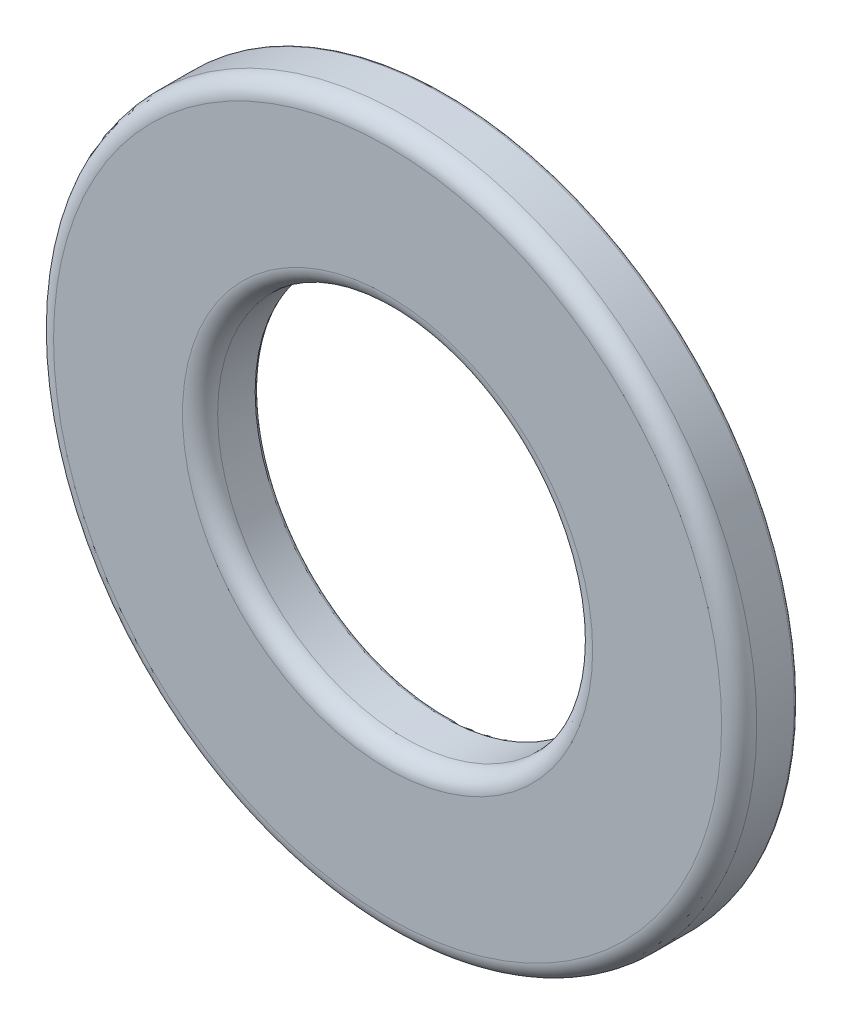
ISO-10303-21;
HEADER;
FILE_DESCRIPTION(('STEP AP214'),'2;1');
FILE_NAME('part.step','',(''),(''),'','','');
FILE_SCHEMA(('AUTOMOTIVE_DESIGN { 1 0 10303 214 1 1 1 1 }'));
ENDSEC;
DATA;
#1=APPLICATION_CONTEXT('core data for automotive mechanical design processes');
#2=APPLICATION_PROTOCOL_DEFINITION('international standard','automotive_design',2000,#1);
#3=PRODUCT_CONTEXT('',#1,'mechanical');
#4=PRODUCT('Part','Part','',(#3));
#5=PRODUCT_RELATED_PRODUCT_CATEGORY('part','',(#4));
#6=PRODUCT_DEFINITION_FORMATION('','',#4);
#7=PRODUCT_DEFINITION_CONTEXT('part definition',#1,'design');
#8=PRODUCT_DEFINITION('design','',#6,#7);
#9=PRODUCT_DEFINITION_SHAPE('','',#8);
#10=(LENGTH_UNIT() NAMED_UNIT(*) SI_UNIT(.MILLI.,.METRE.));
#11=(NAMED_UNIT(*) PLANE_ANGLE_UNIT() SI_UNIT($,.RADIAN.));
#12=(NAMED_UNIT(*) SI_UNIT($,.STERADIAN.) SOLID_ANGLE_UNIT());
#13=UNCERTAINTY_MEASURE_WITH_UNIT(LENGTH_MEASURE(1.E-05),#10,'distance_accuracy_value','');
#14=(GEOMETRIC_REPRESENTATION_CONTEXT(3) GLOBAL_UNCERTAINTY_ASSIGNED_CONTEXT((#13)) GLOBAL_UNIT_ASSIGNED_CONTEXT((#10,
#11,#12)) REPRESENTATION_CONTEXT('',''));
#15=CARTESIAN_POINT('',(0.,0.,0.));
#16=DIRECTION('',(0.,0.,1.));
#17=DIRECTION('',(1.,0.,0.));
#18=AXIS2_PLACEMENT_3D('',#15,#16,#17);
#19=CARTESIAN_POINT('',(0.,0.,-0.25));
#20=DIRECTION('',(0.,0.,1.));
#21=DIRECTION('',(1.,0.,0.));
#22=AXIS2_PLACEMENT_3D('',#19,#20,#21);
#23=CYLINDRICAL_SURFACE('',#22,3.);
#24=CARTESIAN_POINT('',(0.,0.,-0.22));
#25=DIRECTION('',(0.,0.,1.));
#26=DIRECTION('',(1.,0.,0.));
#27=AXIS2_PLACEMENT_3D('',#24,#25,#26);
#28=CIRCLE('',#27,3.);
#29=CARTESIAN_POINT('',(3.,0.,-0.22));
#30=VERTEX_POINT('',#29);
#31=EDGE_CURVE('E96',#30,#30,#28,.T.);
#32=ORIENTED_EDGE('',*,*,#31,.T.);
#33=EDGE_LOOP('',(#32));
#34=FACE_BOUND('',#33,.T.);
#35=CARTESIAN_POINT('',(0.,0.,0.1));
#36=DIRECTION('',(0.,0.,1.));
#37=DIRECTION('',(1.,0.,0.));
#38=AXIS2_PLACEMENT_3D('',#35,#36,#37);
#39=CIRCLE('',#38,3.);
#40=CARTESIAN_POINT('',(3.,0.,0.1));
#41=VERTEX_POINT('',#40);
#42=EDGE_CURVE('E101',#41,#41,#39,.F.);
#43=ORIENTED_EDGE('',*,*,#42,.T.);
#44=EDGE_LOOP('',(#43));
#45=FACE_BOUND('',#44,.T.);
#46=ADVANCED_FACE('F81',(#34,#45),#23,.T.);
#47=CARTESIAN_POINT('',(0.,0.,-0.25));
#48=DIRECTION('',(0.,0.,1.));
#49=DIRECTION('',(1.,0.,0.));
#50=AXIS2_PLACEMENT_3D('',#47,#48,#49);
#51=PLANE('',#50);
#52=CARTESIAN_POINT('',(0.,0.,-0.25));
#53=DIRECTION('',(0.,0.,1.));
#54=DIRECTION('',(1.,0.,0.));
#55=AXIS2_PLACEMENT_3D('',#52,#53,#54);
#56=CIRCLE('',#55,2.97);
#57=CARTESIAN_POINT('',(2.97,0.,-0.25));
#58=VERTEX_POINT('',#57);
#59=EDGE_CURVE('E88',#58,#58,#56,.F.);
#60=ORIENTED_EDGE('',*,*,#59,.T.);
#61=EDGE_LOOP('',(#60));
#62=FACE_BOUND('',#61,.T.);
#63=CARTESIAN_POINT('',(0.,0.,-0.25));
#64=DIRECTION('',(0.,0.,1.));
#65=DIRECTION('',(1.,0.,0.));
#66=AXIS2_PLACEMENT_3D('',#63,#64,#65);
#67=CIRCLE('',#66,1.63);
#68=CARTESIAN_POINT('',(1.63,0.,-0.25));
#69=VERTEX_POINT('',#68);
#70=EDGE_CURVE('E92',#69,#69,#67,.T.);
#71=ORIENTED_EDGE('',*,*,#70,.T.);
#72=EDGE_LOOP('',(#71));
#73=FACE_BOUND('',#72,.T.);
#74=ADVANCED_FACE('F134',(#62,#73),#51,.F.);
#75=CARTESIAN_POINT('',(0.,0.,-0.25));
#76=DIRECTION('',(0.,0.,1.));
#77=DIRECTION('',(1.,0.,0.));
#78=AXIS2_PLACEMENT_3D('',#75,#76,#77);
#79=CYLINDRICAL_SURFACE('',#78,1.6);
#80=CARTESIAN_POINT('',(0.,0.,-0.22));
#81=DIRECTION('',(0.,0.,1.));
#82=DIRECTION('',(1.,0.,0.));
#83=AXIS2_PLACEMENT_3D('',#80,#81,#82);
#84=CIRCLE('',#83,1.6);
#85=CARTESIAN_POINT('',(1.6,0.,-0.22));
#86=VERTEX_POINT('',#85);
#87=EDGE_CURVE('E11',#86,#86,#84,.F.);
#88=ORIENTED_EDGE('',*,*,#87,.T.);
#89=EDGE_LOOP('',(#88));
#90=FACE_BOUND('',#89,.T.);
#91=CARTESIAN_POINT('',(0.,0.,0.1));
#92=DIRECTION('',(0.,0.,1.));
#93=DIRECTION('',(1.,0.,0.));
#94=AXIS2_PLACEMENT_3D('',#91,#92,#93);
#95=CIRCLE('',#94,1.6);
#96=CARTESIAN_POINT('',(1.6,0.,0.1));
#97=VERTEX_POINT('',#96);
#98=EDGE_CURVE('E110',#97,#97,#95,.T.);
#99=ORIENTED_EDGE('',*,*,#98,.T.);
#100=EDGE_LOOP('',(#99));
#101=FACE_BOUND('',#100,.T.);
#102=ADVANCED_FACE('F114',(#90,#101),#79,.F.);
#103=CARTESIAN_POINT('',(0.,0.,0.25));
#104=DIRECTION('',(0.,0.,1.));
#105=DIRECTION('',(1.,0.,0.));
#106=AXIS2_PLACEMENT_3D('',#103,#104,#105);
#107=PLANE('',#106);
#108=CARTESIAN_POINT('',(0.,0.,0.25));
#109=DIRECTION('',(0.,0.,1.));
#110=DIRECTION('',(1.,0.,0.));
#111=AXIS2_PLACEMENT_3D('',#108,#109,#110);
#112=CIRCLE('',#111,1.75);
#113=CARTESIAN_POINT('',(1.75,0.,0.25));
#114=VERTEX_POINT('',#113);
#115=EDGE_CURVE('E104',#114,#114,#112,.F.);
#116=ORIENTED_EDGE('',*,*,#115,.T.);
#117=EDGE_LOOP('',(#116));
#118=FACE_BOUND('',#117,.T.);
#119=CARTESIAN_POINT('',(0.,0.,0.25));
#120=DIRECTION('',(0.,0.,1.));
#121=DIRECTION('',(1.,0.,0.));
#122=AXIS2_PLACEMENT_3D('',#119,#120,#121);
#123=CIRCLE('',#122,2.85);
#124=CARTESIAN_POINT('',(2.85,0.,0.25));
#125=VERTEX_POINT('',#124);
#126=EDGE_CURVE('E107',#125,#125,#123,.T.);
#127=ORIENTED_EDGE('',*,*,#126,.T.);
#128=EDGE_LOOP('',(#127));
#129=FACE_BOUND('',#128,.T.);
#130=ADVANCED_FACE('F119',(#118,#129),#107,.T.);
#131=CARTESIAN_POINT('',(0.,0.,0.1));
#132=DIRECTION('',(0.,0.,1.));
#133=DIRECTION('',(1.,0.,0.));
#134=AXIS2_PLACEMENT_3D('',#131,#132,#133);
#135=TOROIDAL_SURFACE('',#134,1.75,0.15);
#136=ORIENTED_EDGE('',*,*,#115,.F.);
#137=EDGE_LOOP('',(#136));
#138=FACE_BOUND('',#137,.T.);
#139=ORIENTED_EDGE('',*,*,#98,.F.);
#140=EDGE_LOOP('',(#139));
#141=FACE_BOUND('',#140,.T.);
#142=ADVANCED_FACE('F116',(#138,#141),#135,.T.);
#143=CARTESIAN_POINT('',(0.,0.,0.1));
#144=DIRECTION('',(0.,0.,1.));
#145=DIRECTION('',(1.,0.,0.));
#146=AXIS2_PLACEMENT_3D('',#143,#144,#145);
#147=TOROIDAL_SURFACE('',#146,2.85,0.15);
#148=ORIENTED_EDGE('',*,*,#42,.F.);
#149=EDGE_LOOP('',(#148));
#150=FACE_BOUND('',#149,.T.);
#151=ORIENTED_EDGE('',*,*,#126,.F.);
#152=EDGE_LOOP('',(#151));
#153=FACE_BOUND('',#152,.T.);
#154=ADVANCED_FACE('F118',(#150,#153),#147,.T.);
#155=CARTESIAN_POINT('',(0.,0.,-0.22));
#156=DIRECTION('',(0.,0.,1.));
#157=DIRECTION('',(1.,0.,0.));
#158=AXIS2_PLACEMENT_3D('',#155,#156,#157);
#159=TOROIDAL_SURFACE('',#158,2.97,0.03);
#160=ORIENTED_EDGE('',*,*,#59,.F.);
#161=EDGE_LOOP('',(#160));
#162=FACE_BOUND('',#161,.T.);
#163=ORIENTED_EDGE('',*,*,#31,.F.);
#164=EDGE_LOOP('',(#163));
#165=FACE_BOUND('',#164,.T.);
#166=ADVANCED_FACE('F126',(#162,#165),#159,.T.);
#167=CARTESIAN_POINT('',(0.,0.,-0.22));
#168=DIRECTION('',(0.,0.,1.));
#169=DIRECTION('',(1.,0.,0.));
#170=AXIS2_PLACEMENT_3D('',#167,#168,#169);
#171=TOROIDAL_SURFACE('',#170,1.63,0.03);
#172=ORIENTED_EDGE('',*,*,#87,.F.);
#173=EDGE_LOOP('',(#172));
#174=FACE_BOUND('',#173,.T.);
#175=ORIENTED_EDGE('',*,*,#70,.F.);
#176=EDGE_LOOP('',(#175));
#177=FACE_BOUND('',#176,.T.);
#178=ADVANCED_FACE('F83',(#174,#177),#171,.T.);
#179=CLOSED_SHELL('',(#46,#74,#102,#130,#142,#154,#166,#178));
#180=MANIFOLD_SOLID_BREP('B2',#179);
#181=ADVANCED_BREP_SHAPE_REPRESENTATION('',(#18,#180),#14);
#182=SHAPE_DEFINITION_REPRESENTATION(#9,#181);
ENDSEC;
END-ISO-10303-21;
